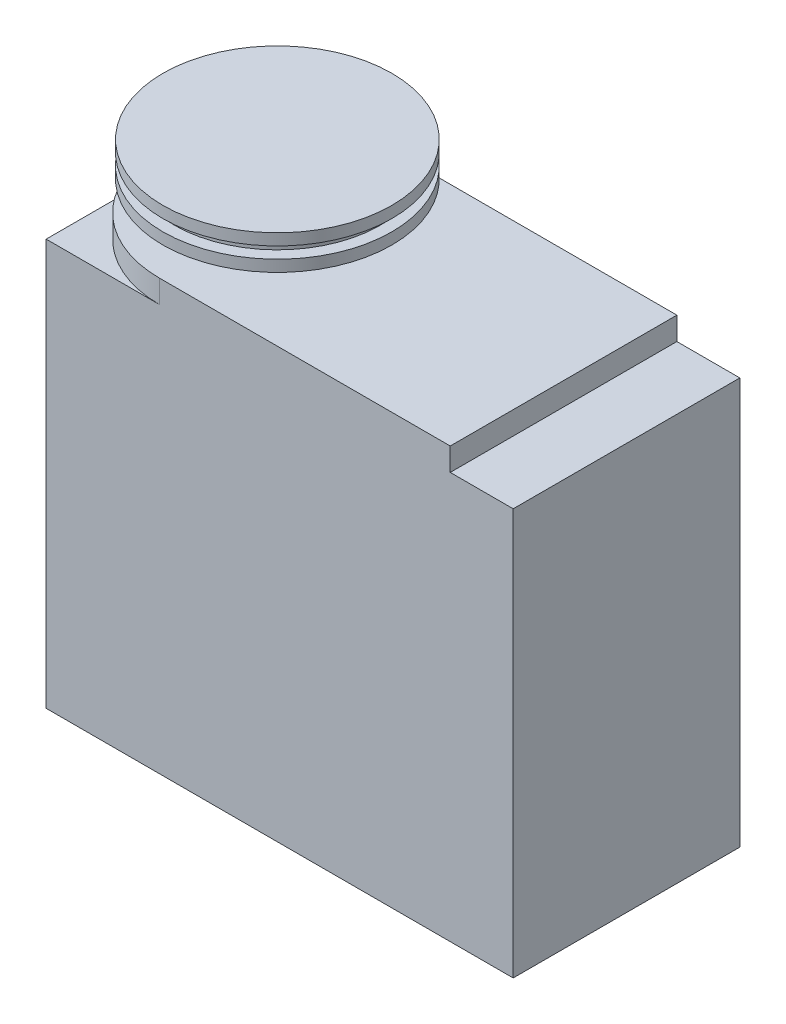
ISO-10303-21;
HEADER;
FILE_DESCRIPTION(('STEP AP214'),'2;1');
FILE_NAME('part.step','',(''),(''),'','','');
FILE_SCHEMA(('AUTOMOTIVE_DESIGN { 1 0 10303 214 1 1 1 1 }'));
ENDSEC;
DATA;
#1=APPLICATION_CONTEXT('core data for automotive mechanical design processes');
#2=APPLICATION_PROTOCOL_DEFINITION('international standard','automotive_design',2000,#1);
#3=PRODUCT_CONTEXT('',#1,'mechanical');
#4=PRODUCT('Part','Part','',(#3));
#5=PRODUCT_RELATED_PRODUCT_CATEGORY('part','',(#4));
#6=PRODUCT_DEFINITION_FORMATION('','',#4);
#7=PRODUCT_DEFINITION_CONTEXT('part definition',#1,'design');
#8=PRODUCT_DEFINITION('design','',#6,#7);
#9=PRODUCT_DEFINITION_SHAPE('','',#8);
#10=(LENGTH_UNIT() NAMED_UNIT(*) SI_UNIT(.MILLI.,.METRE.));
#11=(NAMED_UNIT(*) PLANE_ANGLE_UNIT() SI_UNIT($,.RADIAN.));
#12=(NAMED_UNIT(*) SI_UNIT($,.STERADIAN.) SOLID_ANGLE_UNIT());
#13=UNCERTAINTY_MEASURE_WITH_UNIT(LENGTH_MEASURE(1.E-05),#10,'distance_accuracy_value','');
#14=(GEOMETRIC_REPRESENTATION_CONTEXT(3) GLOBAL_UNCERTAINTY_ASSIGNED_CONTEXT((#13)) GLOBAL_UNIT_ASSIGNED_CONTEXT((#10,
#11,#12)) REPRESENTATION_CONTEXT('',''));
#15=CARTESIAN_POINT('',(0.,0.,0.));
#16=DIRECTION('',(0.,0.,1.));
#17=DIRECTION('',(1.,0.,0.));
#18=AXIS2_PLACEMENT_3D('',#15,#16,#17);
#19=CARTESIAN_POINT('',(-10.1,-1.75213704881182,0.));
#20=DIRECTION('',(0.,1.,0.));
#21=DIRECTION('',(0.,0.,1.));
#22=AXIS2_PLACEMENT_3D('',#19,#20,#21);
#23=CYLINDRICAL_SURFACE('',#22,6.);
#24=CARTESIAN_POINT('',(-10.1,-1.75213704881182,0.));
#25=DIRECTION('',(0.,-1.,0.));
#26=DIRECTION('',(0.,0.,-1.));
#27=AXIS2_PLACEMENT_3D('',#24,#25,#26);
#28=CIRCLE('',#27,6.);
#29=CARTESIAN_POINT('',(-10.1,-1.75213704881182,-6.));
#30=VERTEX_POINT('',#29);
#31=EDGE_CURVE('E54',#30,#30,#28,.T.);
#32=ORIENTED_EDGE('',*,*,#31,.F.);
#33=EDGE_LOOP('',(#32));
#34=FACE_BOUND('',#33,.T.);
#35=CARTESIAN_POINT('',(-10.1,0.,0.));
#36=DIRECTION('',(0.,-1.,0.));
#37=DIRECTION('',(0.,0.,-1.));
#38=AXIS2_PLACEMENT_3D('',#35,#36,#37);
#39=CIRCLE('',#38,6.);
#40=CARTESIAN_POINT('',(-10.1,0.,-6.));
#41=VERTEX_POINT('',#40);
#42=EDGE_CURVE('E50',#41,#41,#39,.T.);
#43=ORIENTED_EDGE('',*,*,#42,.T.);
#44=EDGE_LOOP('',(#43));
#45=FACE_BOUND('',#44,.T.);
#46=ADVANCED_FACE('F47',(#34,#45),#23,.T.);
#47=CARTESIAN_POINT('',(-10.1,-1.75213704881182,0.));
#48=DIRECTION('',(0.,-1.,0.));
#49=DIRECTION('',(0.,0.,-1.));
#50=AXIS2_PLACEMENT_3D('',#47,#48,#49);
#51=PLANE('',#50);
#52=CARTESIAN_POINT('',(-10.1,-1.75213704881182,0.));
#53=DIRECTION('',(0.,-1.,0.));
#54=DIRECTION('',(0.,0.,-1.));
#55=AXIS2_PLACEMENT_3D('',#52,#53,#54);
#56=CIRCLE('',#55,2.5);
#57=CARTESIAN_POINT('',(-10.1,-1.75213704881182,-2.5));
#58=VERTEX_POINT('',#57);
#59=EDGE_CURVE('E11',#58,#58,#56,.T.);
#60=ORIENTED_EDGE('',*,*,#59,.F.);
#61=EDGE_LOOP('',(#60));
#62=FACE_BOUND('',#61,.T.);
#63=ORIENTED_EDGE('',*,*,#31,.T.);
#64=EDGE_LOOP('',(#63));
#65=FACE_BOUND('',#64,.T.);
#66=ADVANCED_FACE('F71',(#62,#65),#51,.T.);
#67=CARTESIAN_POINT('',(-10.1,0.,0.));
#68=DIRECTION('',(0.,-1.,0.));
#69=DIRECTION('',(0.,0.,-1.));
#70=AXIS2_PLACEMENT_3D('',#67,#68,#69);
#71=PLANE('',#70);
#72=ORIENTED_EDGE('',*,*,#42,.F.);
#73=EDGE_LOOP('',(#72));
#74=FACE_BOUND('',#73,.T.);
#75=ADVANCED_FACE('F68',(#74),#71,.F.);
#76=CARTESIAN_POINT('',(-10.1,-5.25213704881182,0.));
#77=DIRECTION('',(0.,1.,0.));
#78=DIRECTION('',(0.,0.,1.));
#79=AXIS2_PLACEMENT_3D('',#76,#77,#78);
#80=CYLINDRICAL_SURFACE('',#79,2.5);
#81=CARTESIAN_POINT('',(-10.1,-5.25213704881182,0.));
#82=DIRECTION('',(0.,-1.,0.));
#83=DIRECTION('',(0.,0.,-1.));
#84=AXIS2_PLACEMENT_3D('',#81,#82,#83);
#85=CIRCLE('',#84,2.5);
#86=CARTESIAN_POINT('',(-10.1,-5.25213704881182,-2.5));
#87=VERTEX_POINT('',#86);
#88=EDGE_CURVE('E60',#87,#87,#85,.T.);
#89=ORIENTED_EDGE('',*,*,#88,.F.);
#90=EDGE_LOOP('',(#89));
#91=FACE_BOUND('',#90,.T.);
#92=ORIENTED_EDGE('',*,*,#59,.T.);
#93=EDGE_LOOP('',(#92));
#94=FACE_BOUND('',#93,.T.);
#95=ADVANCED_FACE('F70',(#91,#94),#80,.T.);
#96=CARTESIAN_POINT('',(-10.1,-5.25213704881182,0.));
#97=DIRECTION('',(0.,-1.,0.));
#98=DIRECTION('',(0.,0.,-1.));
#99=AXIS2_PLACEMENT_3D('',#96,#97,#98);
#100=PLANE('',#99);
#101=ORIENTED_EDGE('',*,*,#88,.T.);
#102=EDGE_LOOP('',(#101));
#103=FACE_BOUND('',#102,.T.);
#104=ADVANCED_FACE('F76',(#103),#100,.T.);
#105=CLOSED_SHELL('',(#46,#66,#75,#95,#104));
#106=MANIFOLD_SOLID_BREP('B2',#105);
#107=CARTESIAN_POINT('',(-20.4,35.5,9.9));
#108=DIRECTION('',(1.,0.,0.));
#109=DIRECTION('',(0.,0.,-1.));
#110=AXIS2_PLACEMENT_3D('',#107,#108,#109);
#111=PLANE('',#110);
#112=DIRECTION('',(0.,0.,1.));
#113=VECTOR('',#112,1.);
#114=CARTESIAN_POINT('',(-20.4,0.,9.9));
#115=LINE('',#114,#113);
#116=CARTESIAN_POINT('',(-20.4,0.,-9.9));
#117=VERTEX_POINT('',#116);
#118=CARTESIAN_POINT('',(-20.4,0.,9.9));
#119=VERTEX_POINT('',#118);
#120=EDGE_CURVE('E322',#117,#119,#115,.T.);
#121=ORIENTED_EDGE('',*,*,#120,.T.);
#122=DIRECTION('',(0.,-1.,0.));
#123=VECTOR('',#122,1.);
#124=CARTESIAN_POINT('',(-20.4,35.5,9.9));
#125=LINE('',#124,#123);
#126=CARTESIAN_POINT('',(-20.4,35.5,9.9));
#127=VERTEX_POINT('',#126);
#128=EDGE_CURVE('E330',#127,#119,#125,.T.);
#129=ORIENTED_EDGE('',*,*,#128,.F.);
#130=DIRECTION('',(0.,0.,1.));
#131=VECTOR('',#130,1.);
#132=CARTESIAN_POINT('',(-20.4,35.5,9.9));
#133=LINE('',#132,#131);
#134=CARTESIAN_POINT('',(-20.4,35.5,0.));
#135=VERTEX_POINT('',#134);
#136=EDGE_CURVE('E306',#135,#127,#133,.T.);
#137=ORIENTED_EDGE('',*,*,#136,.F.);
#138=CARTESIAN_POINT('',(-20.4,35.5,-9.9));
#139=VERTEX_POINT('',#138);
#140=EDGE_CURVE('E307',#139,#135,#133,.T.);
#141=ORIENTED_EDGE('',*,*,#140,.F.);
#142=DIRECTION('',(0.,-1.,0.));
#143=VECTOR('',#142,1.);
#144=CARTESIAN_POINT('',(-20.4,35.5,-9.9));
#145=LINE('',#144,#143);
#146=EDGE_CURVE('E333',#139,#117,#145,.T.);
#147=ORIENTED_EDGE('',*,*,#146,.T.);
#148=EDGE_LOOP('',(#121,#129,#137,#141,#147));
#149=FACE_BOUND('',#148,.T.);
#150=DIRECTION('',(0.,1.,0.));
#151=VECTOR('',#150,1.);
#152=CARTESIAN_POINT('',(-20.4,3.,3.5));
#153=LINE('',#152,#151);
#154=CARTESIAN_POINT('',(-20.4,3.,3.5));
#155=VERTEX_POINT('',#154);
#156=CARTESIAN_POINT('',(-20.4,7.,3.5));
#157=VERTEX_POINT('',#156);
#158=EDGE_CURVE('E235',#155,#157,#153,.T.);
#159=ORIENTED_EDGE('',*,*,#158,.F.);
#160=DIRECTION('',(0.,0.,1.));
#161=VECTOR('',#160,1.);
#162=CARTESIAN_POINT('',(-20.4,3.,-3.5));
#163=LINE('',#162,#161);
#164=CARTESIAN_POINT('',(-20.4,3.,-3.5));
#165=VERTEX_POINT('',#164);
#166=EDGE_CURVE('E232',#165,#155,#163,.T.);
#167=ORIENTED_EDGE('',*,*,#166,.F.);
#168=DIRECTION('',(0.,-1.,0.));
#169=VECTOR('',#168,1.);
#170=CARTESIAN_POINT('',(-20.4,3.,-3.5));
#171=LINE('',#170,#169);
#172=CARTESIAN_POINT('',(-20.4,7.,-3.5));
#173=VERTEX_POINT('',#172);
#174=EDGE_CURVE('E141',#173,#165,#171,.T.);
#175=ORIENTED_EDGE('',*,*,#174,.F.);
#176=DIRECTION('',(0.,0.,-1.));
#177=VECTOR('',#176,1.);
#178=CARTESIAN_POINT('',(-20.4,7.,-3.5));
#179=LINE('',#178,#177);
#180=EDGE_CURVE('E136',#157,#173,#179,.T.);
#181=ORIENTED_EDGE('',*,*,#180,.F.);
#182=EDGE_LOOP('',(#159,#167,#175,#181));
#183=FACE_BOUND('',#182,.T.);
#184=ADVANCED_FACE('F118',(#149,#183),#111,.F.);
#185=CARTESIAN_POINT('',(0.,35.5,0.));
#186=DIRECTION('',(0.,-1.,0.));
#187=DIRECTION('',(0.,0.,-1.));
#188=AXIS2_PLACEMENT_3D('',#185,#186,#187);
#189=PLANE('',#188);
#190=DIRECTION('',(0.,0.,-1.));
#191=VECTOR('',#190,1.);
#192=CARTESIAN_POINT('',(14.9,35.5,-9.90000000000002));
#193=LINE('',#192,#191);
#194=CARTESIAN_POINT('',(14.9,35.5,9.9));
#195=VERTEX_POINT('',#194);
#196=CARTESIAN_POINT('',(14.9,35.5,-9.9));
#197=VERTEX_POINT('',#196);
#198=EDGE_CURVE('E265',#195,#197,#193,.T.);
#199=ORIENTED_EDGE('',*,*,#198,.F.);
#200=DIRECTION('',(1.,0.,0.));
#201=VECTOR('',#200,1.);
#202=CARTESIAN_POINT('',(-20.4,35.5,9.9));
#203=LINE('',#202,#201);
#204=CARTESIAN_POINT('',(20.4,35.5,9.9));
#205=VERTEX_POINT('',#204);
#206=EDGE_CURVE('E311',#195,#205,#203,.T.);
#207=ORIENTED_EDGE('',*,*,#206,.T.);
#208=DIRECTION('',(0.,0.,-1.));
#209=VECTOR('',#208,1.);
#210=CARTESIAN_POINT('',(20.4,35.5,9.9));
#211=LINE('',#210,#209);
#212=CARTESIAN_POINT('',(20.4,35.5,-9.9));
#213=VERTEX_POINT('',#212);
#214=EDGE_CURVE('E297',#205,#213,#211,.T.);
#215=ORIENTED_EDGE('',*,*,#214,.T.);
#216=DIRECTION('',(-1.,0.,0.));
#217=VECTOR('',#216,1.);
#218=CARTESIAN_POINT('',(-20.4,35.5,-9.9));
#219=LINE('',#218,#217);
#220=EDGE_CURVE('E303',#213,#197,#219,.T.);
#221=ORIENTED_EDGE('',*,*,#220,.T.);
#222=EDGE_LOOP('',(#199,#207,#215,#221));
#223=FACE_BOUND('',#222,.T.);
#224=ADVANCED_FACE('F371',(#223),#189,.F.);
#225=CARTESIAN_POINT('',(-10.5,35.5,0.));
#226=DIRECTION('',(0.,1.,0.));
#227=DIRECTION('',(0.,0.,1.));
#228=AXIS2_PLACEMENT_3D('',#225,#226,#227);
#229=CIRCLE('',#228,9.9);
#230=CARTESIAN_POINT('',(-10.5,35.5,-9.9));
#231=VERTEX_POINT('',#230);
#232=EDGE_CURVE('E256',#231,#135,#229,.T.);
#233=ORIENTED_EDGE('',*,*,#232,.F.);
#234=EDGE_CURVE('E301',#231,#139,#219,.T.);
#235=ORIENTED_EDGE('',*,*,#234,.T.);
#236=ORIENTED_EDGE('',*,*,#140,.T.);
#237=EDGE_LOOP('',(#233,#235,#236));
#238=FACE_BOUND('',#237,.T.);
#239=ADVANCED_FACE('F379',(#238),#189,.F.);
#240=CARTESIAN_POINT('',(20.4,35.5,9.9));
#241=DIRECTION('',(-1.,0.,0.));
#242=DIRECTION('',(0.,0.,1.));
#243=AXIS2_PLACEMENT_3D('',#240,#241,#242);
#244=PLANE('',#243);
#245=DIRECTION('',(0.,0.,-1.));
#246=VECTOR('',#245,1.);
#247=CARTESIAN_POINT('',(20.4,0.,9.9));
#248=LINE('',#247,#246);
#249=CARTESIAN_POINT('',(20.4,0.,9.9));
#250=VERTEX_POINT('',#249);
#251=CARTESIAN_POINT('',(20.4,0.,-9.9));
#252=VERTEX_POINT('',#251);
#253=EDGE_CURVE('E296',#250,#252,#248,.T.);
#254=ORIENTED_EDGE('',*,*,#253,.T.);
#255=DIRECTION('',(0.,-1.,0.));
#256=VECTOR('',#255,1.);
#257=CARTESIAN_POINT('',(20.4,35.5,-9.9));
#258=LINE('',#257,#256);
#259=EDGE_CURVE('E122',#213,#252,#258,.T.);
#260=ORIENTED_EDGE('',*,*,#259,.F.);
#261=ORIENTED_EDGE('',*,*,#214,.F.);
#262=DIRECTION('',(0.,-1.,0.));
#263=VECTOR('',#262,1.);
#264=CARTESIAN_POINT('',(20.4,35.5,9.9));
#265=LINE('',#264,#263);
#266=EDGE_CURVE('E315',#205,#250,#265,.T.);
#267=ORIENTED_EDGE('',*,*,#266,.T.);
#268=EDGE_LOOP('',(#254,#260,#261,#267));
#269=FACE_BOUND('',#268,.T.);
#270=ADVANCED_FACE('F120',(#269),#244,.F.);
#271=CARTESIAN_POINT('',(-20.4,35.5,-9.9));
#272=DIRECTION('',(0.,0.,1.));
#273=DIRECTION('',(1.,0.,0.));
#274=AXIS2_PLACEMENT_3D('',#271,#272,#273);
#275=PLANE('',#274);
#276=DIRECTION('',(-1.,0.,0.));
#277=VECTOR('',#276,1.);
#278=CARTESIAN_POINT('',(-20.4,0.,-9.9));
#279=LINE('',#278,#277);
#280=EDGE_CURVE('E319',#252,#117,#279,.T.);
#281=ORIENTED_EDGE('',*,*,#280,.T.);
#282=ORIENTED_EDGE('',*,*,#146,.F.);
#283=ORIENTED_EDGE('',*,*,#234,.F.);
#284=DIRECTION('',(0.,-1.,0.));
#285=VECTOR('',#284,1.);
#286=CARTESIAN_POINT('',(-10.5,37.5,-9.9));
#287=LINE('',#286,#285);
#288=CARTESIAN_POINT('',(-10.5,37.5,-9.9));
#289=VERTEX_POINT('',#288);
#290=EDGE_CURVE('E292',#289,#231,#287,.T.);
#291=ORIENTED_EDGE('',*,*,#290,.F.);
#292=DIRECTION('',(-1.,0.,0.));
#293=VECTOR('',#292,1.);
#294=CARTESIAN_POINT('',(14.9,37.5,-9.90000000000002));
#295=LINE('',#294,#293);
#296=CARTESIAN_POINT('',(14.9,37.5,-9.90000000000002));
#297=VERTEX_POINT('',#296);
#298=EDGE_CURVE('E260',#297,#289,#295,.T.);
#299=ORIENTED_EDGE('',*,*,#298,.F.);
#300=DIRECTION('',(0.,-1.,0.));
#301=VECTOR('',#300,1.);
#302=CARTESIAN_POINT('',(14.9,37.5,-9.90000000000002));
#303=LINE('',#302,#301);
#304=EDGE_CURVE('E274',#297,#197,#303,.T.);
#305=ORIENTED_EDGE('',*,*,#304,.T.);
#306=ORIENTED_EDGE('',*,*,#220,.F.);
#307=ORIENTED_EDGE('',*,*,#259,.T.);
#308=EDGE_LOOP('',(#281,#282,#283,#291,#299,#305,#306,#307));
#309=FACE_BOUND('',#308,.T.);
#310=ADVANCED_FACE('F364',(#309),#275,.F.);
#311=CARTESIAN_POINT('',(-20.4,35.5,9.9));
#312=DIRECTION('',(0.,0.,-1.));
#313=DIRECTION('',(-1.,0.,0.));
#314=AXIS2_PLACEMENT_3D('',#311,#312,#313);
#315=PLANE('',#314);
#316=DIRECTION('',(1.,0.,0.));
#317=VECTOR('',#316,1.);
#318=CARTESIAN_POINT('',(-20.4,0.,9.9));
#319=LINE('',#318,#317);
#320=EDGE_CURVE('E302',#119,#250,#319,.T.);
#321=ORIENTED_EDGE('',*,*,#320,.T.);
#322=ORIENTED_EDGE('',*,*,#266,.F.);
#323=ORIENTED_EDGE('',*,*,#206,.F.);
#324=DIRECTION('',(0.,-1.,0.));
#325=VECTOR('',#324,1.);
#326=CARTESIAN_POINT('',(14.9,37.5,9.9));
#327=LINE('',#326,#325);
#328=CARTESIAN_POINT('',(14.9,37.5,9.9));
#329=VERTEX_POINT('',#328);
#330=EDGE_CURVE('E284',#329,#195,#327,.T.);
#331=ORIENTED_EDGE('',*,*,#330,.F.);
#332=DIRECTION('',(1.,0.,0.));
#333=VECTOR('',#332,1.);
#334=CARTESIAN_POINT('',(-10.5,37.5,9.9));
#335=LINE('',#334,#333);
#336=CARTESIAN_POINT('',(-10.5,37.5,9.9));
#337=VERTEX_POINT('',#336);
#338=EDGE_CURVE('E268',#337,#329,#335,.T.);
#339=ORIENTED_EDGE('',*,*,#338,.F.);
#340=DIRECTION('',(0.,-1.,0.));
#341=VECTOR('',#340,1.);
#342=CARTESIAN_POINT('',(-10.5,37.5,9.9));
#343=LINE('',#342,#341);
#344=CARTESIAN_POINT('',(-10.5,35.5,9.9));
#345=VERTEX_POINT('',#344);
#346=EDGE_CURVE('E288',#337,#345,#343,.T.);
#347=ORIENTED_EDGE('',*,*,#346,.T.);
#348=EDGE_CURVE('E312',#127,#345,#203,.T.);
#349=ORIENTED_EDGE('',*,*,#348,.F.);
#350=ORIENTED_EDGE('',*,*,#128,.T.);
#351=EDGE_LOOP('',(#321,#322,#323,#331,#339,#347,#349,#350));
#352=FACE_BOUND('',#351,.T.);
#353=ADVANCED_FACE('F354',(#352),#315,.F.);
#354=EDGE_CURVE('E251',#135,#345,#229,.T.);
#355=ORIENTED_EDGE('',*,*,#354,.F.);
#356=ORIENTED_EDGE('',*,*,#136,.T.);
#357=ORIENTED_EDGE('',*,*,#348,.T.);
#358=EDGE_LOOP('',(#355,#356,#357));
#359=FACE_BOUND('',#358,.T.);
#360=ADVANCED_FACE('F382',(#359),#189,.F.);
#361=CARTESIAN_POINT('',(0.,0.,0.));
#362=DIRECTION('',(0.,-1.,0.));
#363=DIRECTION('',(0.,0.,-1.));
#364=AXIS2_PLACEMENT_3D('',#361,#362,#363);
#365=PLANE('',#364);
#366=ORIENTED_EDGE('',*,*,#253,.F.);
#367=ORIENTED_EDGE('',*,*,#320,.F.);
#368=ORIENTED_EDGE('',*,*,#120,.F.);
#369=ORIENTED_EDGE('',*,*,#280,.F.);
#370=EDGE_LOOP('',(#366,#367,#368,#369));
#371=FACE_BOUND('',#370,.T.);
#372=ADVANCED_FACE('F377',(#371),#365,.T.);
#373=CARTESIAN_POINT('',(-10.5,37.5,0.));
#374=DIRECTION('',(0.,-1.,0.));
#375=DIRECTION('',(0.,0.,-1.));
#376=AXIS2_PLACEMENT_3D('',#373,#374,#375);
#377=CYLINDRICAL_SURFACE('',#376,9.9);
#378=ORIENTED_EDGE('',*,*,#232,.T.);
#379=ORIENTED_EDGE('',*,*,#354,.T.);
#380=ORIENTED_EDGE('',*,*,#346,.F.);
#381=CARTESIAN_POINT('',(-10.5,37.5,0.));
#382=DIRECTION('',(0.,1.,0.));
#383=DIRECTION('',(0.,0.,1.));
#384=AXIS2_PLACEMENT_3D('',#381,#382,#383);
#385=CIRCLE('',#384,9.9);
#386=EDGE_CURVE('E264',#289,#337,#385,.T.);
#387=ORIENTED_EDGE('',*,*,#386,.F.);
#388=ORIENTED_EDGE('',*,*,#290,.T.);
#389=EDGE_LOOP('',(#378,#379,#380,#387,#388));
#390=FACE_BOUND('',#389,.T.);
#391=ADVANCED_FACE('F348',(#390),#377,.T.);
#392=CARTESIAN_POINT('',(14.9,37.5,-9.90000000000002));
#393=DIRECTION('',(-1.,0.,0.));
#394=DIRECTION('',(0.,0.,1.));
#395=AXIS2_PLACEMENT_3D('',#392,#393,#394);
#396=PLANE('',#395);
#397=ORIENTED_EDGE('',*,*,#198,.T.);
#398=ORIENTED_EDGE('',*,*,#304,.F.);
#399=DIRECTION('',(0.,0.,-1.));
#400=VECTOR('',#399,1.);
#401=CARTESIAN_POINT('',(14.9,37.5,-9.90000000000002));
#402=LINE('',#401,#400);
#403=EDGE_CURVE('E271',#329,#297,#402,.T.);
#404=ORIENTED_EDGE('',*,*,#403,.F.);
#405=ORIENTED_EDGE('',*,*,#330,.T.);
#406=EDGE_LOOP('',(#397,#398,#404,#405));
#407=FACE_BOUND('',#406,.T.);
#408=ADVANCED_FACE('F418',(#407),#396,.F.);
#409=CARTESIAN_POINT('',(-10.5,37.5,0.));
#410=DIRECTION('',(0.,1.,0.));
#411=DIRECTION('',(0.,0.,1.));
#412=AXIS2_PLACEMENT_3D('',#409,#410,#411);
#413=PLANE('',#412);
#414=CARTESIAN_POINT('',(-10.1,37.5,0.));
#415=DIRECTION('',(0.,1.,0.));
#416=DIRECTION('',(0.,0.,1.));
#417=AXIS2_PLACEMENT_3D('',#414,#415,#416);
#418=CIRCLE('',#417,6.);
#419=CARTESIAN_POINT('',(-10.1,37.5,6.));
#420=VERTEX_POINT('',#419);
#421=EDGE_CURVE('E242',#420,#420,#418,.T.);
#422=ORIENTED_EDGE('',*,*,#421,.F.);
#423=EDGE_LOOP('',(#422));
#424=FACE_BOUND('',#423,.T.);
#425=ORIENTED_EDGE('',*,*,#298,.T.);
#426=ORIENTED_EDGE('',*,*,#386,.T.);
#427=ORIENTED_EDGE('',*,*,#338,.T.);
#428=ORIENTED_EDGE('',*,*,#403,.T.);
#429=EDGE_LOOP('',(#425,#426,#427,#428));
#430=FACE_BOUND('',#429,.T.);
#431=ADVANCED_FACE('F359',(#424,#430),#413,.T.);
#432=CARTESIAN_POINT('',(-10.1,39.25,0.));
#433=DIRECTION('',(0.,-1.,0.));
#434=DIRECTION('',(0.,0.,-1.));
#435=AXIS2_PLACEMENT_3D('',#432,#433,#434);
#436=CYLINDRICAL_SURFACE('',#435,6.);
#437=CARTESIAN_POINT('',(-10.1,39.25,0.));
#438=DIRECTION('',(0.,1.,0.));
#439=DIRECTION('',(0.,0.,1.));
#440=AXIS2_PLACEMENT_3D('',#437,#438,#439);
#441=CIRCLE('',#440,6.);
#442=CARTESIAN_POINT('',(-10.1,39.25,6.));
#443=VERTEX_POINT('',#442);
#444=EDGE_CURVE('E252',#443,#443,#441,.T.);
#445=ORIENTED_EDGE('',*,*,#444,.F.);
#446=EDGE_LOOP('',(#445));
#447=FACE_BOUND('',#446,.T.);
#448=ORIENTED_EDGE('',*,*,#421,.T.);
#449=EDGE_LOOP('',(#448));
#450=FACE_BOUND('',#449,.T.);
#451=ADVANCED_FACE('F431',(#447,#450),#436,.T.);
#452=CARTESIAN_POINT('',(-10.1,39.25,0.));
#453=DIRECTION('',(0.,1.,0.));
#454=DIRECTION('',(0.,0.,1.));
#455=AXIS2_PLACEMENT_3D('',#452,#453,#454);
#456=PLANE('',#455);
#457=CARTESIAN_POINT('',(-10.1,39.25,0.));
#458=DIRECTION('',(0.,1.,0.));
#459=DIRECTION('',(0.,0.,1.));
#460=AXIS2_PLACEMENT_3D('',#457,#458,#459);
#461=CIRCLE('',#460,2.75);
#462=CARTESIAN_POINT('',(-10.1,39.25,2.75));
#463=VERTEX_POINT('',#462);
#464=EDGE_CURVE('E128',#463,#463,#461,.T.);
#465=ORIENTED_EDGE('',*,*,#464,.F.);
#466=EDGE_LOOP('',(#465));
#467=FACE_BOUND('',#466,.T.);
#468=ORIENTED_EDGE('',*,*,#444,.T.);
#469=EDGE_LOOP('',(#468));
#470=FACE_BOUND('',#469,.T.);
#471=ADVANCED_FACE('F439',(#467,#470),#456,.T.);
#472=CARTESIAN_POINT('',(-10.1,40.25,0.));
#473=DIRECTION('',(0.,-1.,0.));
#474=DIRECTION('',(0.,0.,-1.));
#475=AXIS2_PLACEMENT_3D('',#472,#473,#474);
#476=CYLINDRICAL_SURFACE('',#475,2.75);
#477=CARTESIAN_POINT('',(-10.1,40.25,0.));
#478=DIRECTION('',(0.,1.,0.));
#479=DIRECTION('',(0.,0.,1.));
#480=AXIS2_PLACEMENT_3D('',#477,#478,#479);
#481=CIRCLE('',#480,2.75);
#482=CARTESIAN_POINT('',(-10.1,40.25,2.75));
#483=VERTEX_POINT('',#482);
#484=EDGE_CURVE('E237',#483,#483,#481,.T.);
#485=ORIENTED_EDGE('',*,*,#484,.F.);
#486=EDGE_LOOP('',(#485));
#487=FACE_BOUND('',#486,.T.);
#488=ORIENTED_EDGE('',*,*,#464,.T.);
#489=EDGE_LOOP('',(#488));
#490=FACE_BOUND('',#489,.T.);
#491=ADVANCED_FACE('F447',(#487,#490),#476,.T.);
#492=CARTESIAN_POINT('',(-25.4,3.,3.5));
#493=DIRECTION('',(0.,0.,-1.));
#494=DIRECTION('',(0.,1.,0.));
#495=AXIS2_PLACEMENT_3D('',#492,#493,#494);
#496=PLANE('',#495);
#497=ORIENTED_EDGE('',*,*,#158,.T.);
#498=DIRECTION('',(1.,0.,0.));
#499=VECTOR('',#498,1.);
#500=CARTESIAN_POINT('',(-25.4,7.,3.5));
#501=LINE('',#500,#499);
#502=CARTESIAN_POINT('',(-25.4,7.,3.5));
#503=VERTEX_POINT('',#502);
#504=EDGE_CURVE('E214',#503,#157,#501,.T.);
#505=ORIENTED_EDGE('',*,*,#504,.F.);
#506=DIRECTION('',(0.,1.,0.));
#507=VECTOR('',#506,1.);
#508=CARTESIAN_POINT('',(-25.4,3.,3.5));
#509=LINE('',#508,#507);
#510=CARTESIAN_POINT('',(-25.4,3.,3.5));
#511=VERTEX_POINT('',#510);
#512=EDGE_CURVE('E222',#511,#503,#509,.T.);
#513=ORIENTED_EDGE('',*,*,#512,.F.);
#514=DIRECTION('',(1.,0.,0.));
#515=VECTOR('',#514,1.);
#516=CARTESIAN_POINT('',(-25.4,3.,3.5));
#517=LINE('',#516,#515);
#518=EDGE_CURVE('E647',#511,#155,#517,.T.);
#519=ORIENTED_EDGE('',*,*,#518,.T.);
#520=EDGE_LOOP('',(#497,#505,#513,#519));
#521=FACE_BOUND('',#520,.T.);
#522=ADVANCED_FACE('F234',(#521),#496,.F.);
#523=CARTESIAN_POINT('',(-25.4,7.,-3.5));
#524=DIRECTION('',(0.,-1.,0.));
#525=DIRECTION('',(0.,0.,-1.));
#526=AXIS2_PLACEMENT_3D('',#523,#524,#525);
#527=PLANE('',#526);
#528=ORIENTED_EDGE('',*,*,#180,.T.);
#529=DIRECTION('',(1.,0.,0.));
#530=VECTOR('',#529,1.);
#531=CARTESIAN_POINT('',(-25.4,7.,-3.5));
#532=LINE('',#531,#530);
#533=CARTESIAN_POINT('',(-25.4,7.,-3.5));
#534=VERTEX_POINT('',#533);
#535=EDGE_CURVE('E217',#534,#173,#532,.T.);
#536=ORIENTED_EDGE('',*,*,#535,.F.);
#537=DIRECTION('',(0.,0.,-1.));
#538=VECTOR('',#537,1.);
#539=CARTESIAN_POINT('',(-25.4,7.,-3.5));
#540=LINE('',#539,#538);
#541=EDGE_CURVE('E210',#503,#534,#540,.T.);
#542=ORIENTED_EDGE('',*,*,#541,.F.);
#543=ORIENTED_EDGE('',*,*,#504,.T.);
#544=EDGE_LOOP('',(#528,#536,#542,#543));
#545=FACE_BOUND('',#544,.T.);
#546=ADVANCED_FACE('F212',(#545),#527,.F.);
#547=CARTESIAN_POINT('',(-25.4,3.,-3.5));
#548=DIRECTION('',(0.,0.,1.));
#549=DIRECTION('',(0.,-1.,0.));
#550=AXIS2_PLACEMENT_3D('',#547,#548,#549);
#551=PLANE('',#550);
#552=ORIENTED_EDGE('',*,*,#174,.T.);
#553=DIRECTION('',(1.,0.,0.));
#554=VECTOR('',#553,1.);
#555=CARTESIAN_POINT('',(-25.4,3.,-3.5));
#556=LINE('',#555,#554);
#557=CARTESIAN_POINT('',(-25.4,3.,-3.5));
#558=VERTEX_POINT('',#557);
#559=EDGE_CURVE('E244',#558,#165,#556,.T.);
#560=ORIENTED_EDGE('',*,*,#559,.F.);
#561=DIRECTION('',(0.,-1.,0.));
#562=VECTOR('',#561,1.);
#563=CARTESIAN_POINT('',(-25.4,3.,-3.5));
#564=LINE('',#563,#562);
#565=EDGE_CURVE('E221',#534,#558,#564,.T.);
#566=ORIENTED_EDGE('',*,*,#565,.F.);
#567=ORIENTED_EDGE('',*,*,#535,.T.);
#568=EDGE_LOOP('',(#552,#560,#566,#567));
#569=FACE_BOUND('',#568,.T.);
#570=ADVANCED_FACE('F468',(#569),#551,.F.);
#571=CARTESIAN_POINT('',(-25.4,3.,-3.5));
#572=DIRECTION('',(0.,1.,0.));
#573=DIRECTION('',(0.,0.,1.));
#574=AXIS2_PLACEMENT_3D('',#571,#572,#573);
#575=PLANE('',#574);
#576=ORIENTED_EDGE('',*,*,#166,.T.);
#577=ORIENTED_EDGE('',*,*,#518,.F.);
#578=DIRECTION('',(0.,0.,1.));
#579=VECTOR('',#578,1.);
#580=CARTESIAN_POINT('',(-25.4,3.,-3.5));
#581=LINE('',#580,#579);
#582=EDGE_CURVE('E227',#558,#511,#581,.T.);
#583=ORIENTED_EDGE('',*,*,#582,.F.);
#584=ORIENTED_EDGE('',*,*,#559,.T.);
#585=EDGE_LOOP('',(#576,#577,#583,#584));
#586=FACE_BOUND('',#585,.T.);
#587=ADVANCED_FACE('F475',(#586),#575,.F.);
#588=CARTESIAN_POINT('',(-25.4,0.,0.));
#589=DIRECTION('',(1.,0.,0.));
#590=DIRECTION('',(0.,0.,-1.));
#591=AXIS2_PLACEMENT_3D('',#588,#589,#590);
#592=PLANE('',#591);
#593=ORIENTED_EDGE('',*,*,#512,.T.);
#594=ORIENTED_EDGE('',*,*,#541,.T.);
#595=ORIENTED_EDGE('',*,*,#565,.T.);
#596=ORIENTED_EDGE('',*,*,#582,.T.);
#597=EDGE_LOOP('',(#593,#594,#595,#596));
#598=FACE_BOUND('',#597,.T.);
#599=ADVANCED_FACE('F225',(#598),#592,.F.);
#600=CARTESIAN_POINT('',(-10.1,41.25,0.));
#601=DIRECTION('',(0.,-1.,0.));
#602=DIRECTION('',(0.,0.,-1.));
#603=AXIS2_PLACEMENT_3D('',#600,#601,#602);
#604=CYLINDRICAL_SURFACE('',#603,10.);
#605=CARTESIAN_POINT('',(-10.1,41.25,0.));
#606=DIRECTION('',(0.,1.,0.));
#607=DIRECTION('',(0.,0.,1.));
#608=AXIS2_PLACEMENT_3D('',#605,#606,#607);
#609=CIRCLE('',#608,10.);
#610=CARTESIAN_POINT('',(-10.1,41.25,10.));
#611=VERTEX_POINT('',#610);
#612=EDGE_CURVE('E636',#611,#611,#609,.T.);
#613=ORIENTED_EDGE('',*,*,#612,.F.);
#614=EDGE_LOOP('',(#613));
#615=FACE_BOUND('',#614,.T.);
#616=CARTESIAN_POINT('',(-10.1,40.25,0.));
#617=DIRECTION('',(0.,1.,0.));
#618=DIRECTION('',(0.,0.,1.));
#619=AXIS2_PLACEMENT_3D('',#616,#617,#618);
#620=CIRCLE('',#619,10.);
#621=CARTESIAN_POINT('',(-10.1,40.25,10.));
#622=VERTEX_POINT('',#621);
#623=EDGE_CURVE('E634',#622,#622,#620,.T.);
#624=ORIENTED_EDGE('',*,*,#623,.T.);
#625=EDGE_LOOP('',(#624));
#626=FACE_BOUND('',#625,.T.);
#627=ADVANCED_FACE('F490',(#615,#626),#604,.T.);
#628=CARTESIAN_POINT('',(-10.1,41.25,0.));
#629=DIRECTION('',(0.,1.,0.));
#630=DIRECTION('',(0.,0.,1.));
#631=AXIS2_PLACEMENT_3D('',#628,#629,#630);
#632=PLANE('',#631);
#633=CARTESIAN_POINT('',(-10.1,41.25,0.));
#634=DIRECTION('',(0.,1.,0.));
#635=DIRECTION('',(0.,0.,1.));
#636=AXIS2_PLACEMENT_3D('',#633,#634,#635);
#637=CIRCLE('',#636,9.);
#638=CARTESIAN_POINT('',(-10.1,41.25,9.));
#639=VERTEX_POINT('',#638);
#640=EDGE_CURVE('E45',#639,#639,#637,.T.);
#641=ORIENTED_EDGE('',*,*,#640,.F.);
#642=EDGE_LOOP('',(#641));
#643=FACE_BOUND('',#642,.T.);
#644=ORIENTED_EDGE('',*,*,#612,.T.);
#645=EDGE_LOOP('',(#644));
#646=FACE_BOUND('',#645,.T.);
#647=ADVANCED_FACE('F497',(#643,#646),#632,.T.);
#648=CARTESIAN_POINT('',(-10.1,40.25,0.));
#649=DIRECTION('',(0.,1.,0.));
#650=DIRECTION('',(0.,0.,1.));
#651=AXIS2_PLACEMENT_3D('',#648,#649,#650);
#652=PLANE('',#651);
#653=ORIENTED_EDGE('',*,*,#484,.T.);
#654=EDGE_LOOP('',(#653));
#655=FACE_BOUND('',#654,.T.);
#656=ORIENTED_EDGE('',*,*,#623,.F.);
#657=EDGE_LOOP('',(#656));
#658=FACE_BOUND('',#657,.T.);
#659=ADVANCED_FACE('F506',(#655,#658),#652,.F.);
#660=CARTESIAN_POINT('',(-10.1,42.25,0.));
#661=DIRECTION('',(0.,-1.,0.));
#662=DIRECTION('',(0.,0.,-1.));
#663=AXIS2_PLACEMENT_3D('',#660,#661,#662);
#664=CYLINDRICAL_SURFACE('',#663,9.);
#665=CARTESIAN_POINT('',(-10.1,42.25,0.));
#666=DIRECTION('',(0.,1.,0.));
#667=DIRECTION('',(0.,0.,1.));
#668=AXIS2_PLACEMENT_3D('',#665,#666,#667);
#669=CIRCLE('',#668,9.);
#670=CARTESIAN_POINT('',(-10.1,42.25,9.));
#671=VERTEX_POINT('',#670);
#672=EDGE_CURVE('E621',#671,#671,#669,.T.);
#673=ORIENTED_EDGE('',*,*,#672,.F.);
#674=EDGE_LOOP('',(#673));
#675=FACE_BOUND('',#674,.T.);
#676=ORIENTED_EDGE('',*,*,#640,.T.);
#677=EDGE_LOOP('',(#676));
#678=FACE_BOUND('',#677,.T.);
#679=ADVANCED_FACE('F514',(#675,#678),#664,.T.);
#680=CARTESIAN_POINT('',(-10.1,43.25,0.));
#681=DIRECTION('',(0.,-1.,0.));
#682=DIRECTION('',(0.,0.,-1.));
#683=AXIS2_PLACEMENT_3D('',#680,#681,#682);
#684=CYLINDRICAL_SURFACE('',#683,10.);
#685=CARTESIAN_POINT('',(-10.1,43.25,0.));
#686=DIRECTION('',(0.,1.,0.));
#687=DIRECTION('',(0.,0.,1.));
#688=AXIS2_PLACEMENT_3D('',#685,#686,#687);
#689=CIRCLE('',#688,10.);
#690=CARTESIAN_POINT('',(-10.1,43.25,10.));
#691=VERTEX_POINT('',#690);
#692=EDGE_CURVE('E627',#691,#691,#689,.T.);
#693=ORIENTED_EDGE('',*,*,#692,.F.);
#694=EDGE_LOOP('',(#693));
#695=FACE_BOUND('',#694,.T.);
#696=CARTESIAN_POINT('',(-10.1,42.25,0.));
#697=DIRECTION('',(0.,1.,0.));
#698=DIRECTION('',(0.,0.,1.));
#699=AXIS2_PLACEMENT_3D('',#696,#697,#698);
#700=CIRCLE('',#699,10.);
#701=CARTESIAN_POINT('',(-10.1,42.25,10.));
#702=VERTEX_POINT('',#701);
#703=EDGE_CURVE('E624',#702,#702,#700,.T.);
#704=ORIENTED_EDGE('',*,*,#703,.T.);
#705=EDGE_LOOP('',(#704));
#706=FACE_BOUND('',#705,.T.);
#707=ADVANCED_FACE('F521',(#695,#706),#684,.T.);
#708=CARTESIAN_POINT('',(-10.1,43.25,0.));
#709=DIRECTION('',(0.,1.,0.));
#710=DIRECTION('',(0.,0.,1.));
#711=AXIS2_PLACEMENT_3D('',#708,#709,#710);
#712=PLANE('',#711);
#713=ORIENTED_EDGE('',*,*,#692,.T.);
#714=EDGE_LOOP('',(#713));
#715=FACE_BOUND('',#714,.T.);
#716=ADVANCED_FACE('F529',(#715),#712,.T.);
#717=CARTESIAN_POINT('',(-10.1,42.25,0.));
#718=DIRECTION('',(0.,1.,0.));
#719=DIRECTION('',(0.,0.,1.));
#720=AXIS2_PLACEMENT_3D('',#717,#718,#719);
#721=PLANE('',#720);
#722=ORIENTED_EDGE('',*,*,#672,.T.);
#723=EDGE_LOOP('',(#722));
#724=FACE_BOUND('',#723,.T.);
#725=ORIENTED_EDGE('',*,*,#703,.F.);
#726=EDGE_LOOP('',(#725));
#727=FACE_BOUND('',#726,.T.);
#728=ADVANCED_FACE('F537',(#724,#727),#721,.F.);
#729=CLOSED_SHELL('',(#184,#224,#239,#270,#310,#353,#360,#372,#391,#408,#431,#451,#471,#491,
#522,#546,#570,#587,#599,#627,#647,#659,#679,#707,#716,#728));
#730=MANIFOLD_SOLID_BREP('B6',#729);
#731=ADVANCED_BREP_SHAPE_REPRESENTATION('',(#18,#106,#730),#14);
#732=SHAPE_DEFINITION_REPRESENTATION(#9,#731);
ENDSEC;
END-ISO-10303-21;
